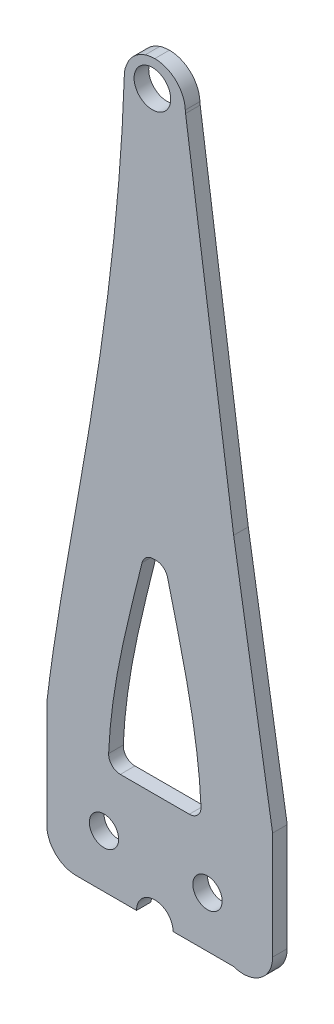
ISO-10303-21;
HEADER;
FILE_DESCRIPTION(('STEP AP214'),'2;1');
FILE_NAME('part.step','',(''),(''),'','','');
FILE_SCHEMA(('AUTOMOTIVE_DESIGN { 1 0 10303 214 1 1 1 1 }'));
ENDSEC;
DATA;
#1=APPLICATION_CONTEXT('core data for automotive mechanical design processes');
#2=APPLICATION_PROTOCOL_DEFINITION('international standard','automotive_design',2000,#1);
#3=PRODUCT_CONTEXT('',#1,'mechanical');
#4=PRODUCT('Part','Part','',(#3));
#5=PRODUCT_RELATED_PRODUCT_CATEGORY('part','',(#4));
#6=PRODUCT_DEFINITION_FORMATION('','',#4);
#7=PRODUCT_DEFINITION_CONTEXT('part definition',#1,'design');
#8=PRODUCT_DEFINITION('design','',#6,#7);
#9=PRODUCT_DEFINITION_SHAPE('','',#8);
#10=(LENGTH_UNIT() NAMED_UNIT(*) SI_UNIT(.MILLI.,.METRE.));
#11=(NAMED_UNIT(*) PLANE_ANGLE_UNIT() SI_UNIT($,.RADIAN.));
#12=(NAMED_UNIT(*) SI_UNIT($,.STERADIAN.) SOLID_ANGLE_UNIT());
#13=UNCERTAINTY_MEASURE_WITH_UNIT(LENGTH_MEASURE(1.E-05),#10,'distance_accuracy_value','');
#14=(GEOMETRIC_REPRESENTATION_CONTEXT(3) GLOBAL_UNCERTAINTY_ASSIGNED_CONTEXT((#13)) GLOBAL_UNIT_ASSIGNED_CONTEXT((#10,
#11,#12)) REPRESENTATION_CONTEXT('',''));
#15=CARTESIAN_POINT('',(0.,0.,0.));
#16=DIRECTION('',(0.,0.,1.));
#17=DIRECTION('',(1.,0.,0.));
#18=AXIS2_PLACEMENT_3D('',#15,#16,#17);
#19=CARTESIAN_POINT('',(-6.83261232794057,-62.1482920645806,1.27));
#20=DIRECTION('',(0.,1.,0.));
#21=DIRECTION('',(0.,0.,1.));
#22=AXIS2_PLACEMENT_3D('',#19,#20,#21);
#23=PLANE('',#22);
#24=DIRECTION('',(1.,0.,0.));
#25=VECTOR('',#24,1.);
#26=CARTESIAN_POINT('',(-6.83261232794057,-62.1482920645806,0.));
#27=LINE('',#26,#25);
#28=CARTESIAN_POINT('',(-6.83261232794057,-62.1482920645806,0.));
#29=VERTEX_POINT('',#28);
#30=CARTESIAN_POINT('',(-1.5875,-62.1482920645806,0.));
#31=VERTEX_POINT('',#30);
#32=EDGE_CURVE('E332',#29,#31,#27,.T.);
#33=ORIENTED_EDGE('',*,*,#32,.T.);
#34=DIRECTION('',(0.,0.,1.));
#35=VECTOR('',#34,1.);
#36=CARTESIAN_POINT('',(-1.5875,-62.1482920645806,0.));
#37=LINE('',#36,#35);
#38=CARTESIAN_POINT('',(-1.5875,-62.1482920645806,1.27));
#39=VERTEX_POINT('',#38);
#40=EDGE_CURVE('E209',#31,#39,#37,.T.);
#41=ORIENTED_EDGE('',*,*,#40,.T.);
#42=DIRECTION('',(1.,0.,0.));
#43=VECTOR('',#42,1.);
#44=CARTESIAN_POINT('',(-6.83261232794057,-62.1482920645806,1.27));
#45=LINE('',#44,#43);
#46=CARTESIAN_POINT('',(-6.83261232794057,-62.1482920645806,1.27));
#47=VERTEX_POINT('',#46);
#48=EDGE_CURVE('E219',#47,#39,#45,.T.);
#49=ORIENTED_EDGE('',*,*,#48,.F.);
#50=DIRECTION('',(0.,0.,-1.));
#51=VECTOR('',#50,1.);
#52=CARTESIAN_POINT('',(-6.83261232794057,-62.1482920645806,1.27));
#53=LINE('',#52,#51);
#54=EDGE_CURVE('E324',#47,#29,#53,.T.);
#55=ORIENTED_EDGE('',*,*,#54,.T.);
#56=EDGE_LOOP('',(#33,#41,#49,#55));
#57=FACE_BOUND('',#56,.T.);
#58=ADVANCED_FACE('F35',(#57),#23,.F.);
#59=CARTESIAN_POINT('',(-2.44371924299133,0.982062169702059,1.27));
#60=DIRECTION('',(0.,0.,-1.));
#61=DIRECTION('',(-1.,0.,0.));
#62=AXIS2_PLACEMENT_3D('',#59,#60,#61);
#63=PLANE('',#62);
#64=CARTESIAN_POINT('',(-0.21004257552965,0.287306267506726,1.27));
#65=DIRECTION('',(0.,0.,-1.));
#66=DIRECTION('',(-1.,0.,0.));
#67=AXIS2_PLACEMENT_3D('',#64,#65,#66);
#68=CIRCLE('',#67,1.5875);
#69=CARTESIAN_POINT('',(-1.79754257552965,0.287306267506726,1.27));
#70=VERTEX_POINT('',#69);
#71=EDGE_CURVE('E770',#70,#70,#68,.T.);
#72=ORIENTED_EDGE('',*,*,#71,.T.);
#73=EDGE_LOOP('',(#72));
#74=FACE_BOUND('',#73,.T.);
#75=CARTESIAN_POINT('',(4.5713098942523,-57.7408408906354,1.27));
#76=DIRECTION('',(0.,0.,-1.));
#77=DIRECTION('',(-1.,0.,0.));
#78=AXIS2_PLACEMENT_3D('',#75,#76,#77);
#79=CIRCLE('',#78,1.27);
#80=CARTESIAN_POINT('',(3.3013098942523,-57.7408408906354,1.27));
#81=VERTEX_POINT('',#80);
#82=EDGE_CURVE('E777',#81,#81,#79,.T.);
#83=ORIENTED_EDGE('',*,*,#82,.T.);
#84=EDGE_LOOP('',(#83));
#85=FACE_BOUND('',#84,.T.);
#86=CARTESIAN_POINT('',(-4.40745117394522,-57.5769821703283,1.27));
#87=DIRECTION('',(0.,0.,-1.));
#88=DIRECTION('',(-1.,0.,0.));
#89=AXIS2_PLACEMENT_3D('',#86,#87,#88);
#90=CIRCLE('',#89,1.27);
#91=CARTESIAN_POINT('',(-5.67745117394522,-57.5769821703283,1.27));
#92=VERTEX_POINT('',#91);
#93=EDGE_CURVE('E210',#92,#92,#90,.T.);
#94=ORIENTED_EDGE('',*,*,#93,.T.);
#95=EDGE_LOOP('',(#94));
#96=FACE_BOUND('',#95,.T.);
#97=ORIENTED_EDGE('',*,*,#48,.T.);
#98=CARTESIAN_POINT('',(0.,-62.1482920645806,1.27));
#99=DIRECTION('',(0.,0.,1.));
#100=DIRECTION('',(1.,0.,0.));
#101=AXIS2_PLACEMENT_3D('',#98,#99,#100);
#102=CIRCLE('',#101,1.5875);
#103=CARTESIAN_POINT('',(1.5875,-62.1482920645806,1.27));
#104=VERTEX_POINT('',#103);
#105=EDGE_CURVE('E204',#104,#39,#102,.T.);
#106=ORIENTED_EDGE('',*,*,#105,.F.);
#107=CARTESIAN_POINT('',(6.83259999999998,-62.1482920645806,1.27));
#108=VERTEX_POINT('',#107);
#109=EDGE_CURVE('E216',#104,#108,#45,.T.);
#110=ORIENTED_EDGE('',*,*,#109,.T.);
#111=CARTESIAN_POINT('',(7.67799206458059,-59.7531199139079,1.27));
#112=DIRECTION('',(0.,0.,1.));
#113=DIRECTION('',(-1.,0.,0.));
#114=AXIS2_PLACEMENT_3D('',#111,#112,#113);
#115=CIRCLE('',#114,2.53998767205942);
#116=CARTESIAN_POINT('',(10.21797973664,-59.7531199139079,1.27));
#117=VERTEX_POINT('',#116);
#118=EDGE_CURVE('E227',#108,#117,#115,.T.);
#119=ORIENTED_EDGE('',*,*,#118,.T.);
#120=DIRECTION('',(0.,1.,0.));
#121=VECTOR('',#120,1.);
#122=CARTESIAN_POINT('',(10.21797973664,-59.7531199139079,1.27));
#123=LINE('',#122,#121);
#124=CARTESIAN_POINT('',(10.21797973664,-50.4317123279406,1.27));
#125=VERTEX_POINT('',#124);
#126=EDGE_CURVE('E233',#117,#125,#123,.T.);
#127=ORIENTED_EDGE('',*,*,#126,.T.);
#128=DIRECTION('',(-0.161209906120702,0.986920141738203,0.));
#129=VECTOR('',#128,1.);
#130=CARTESIAN_POINT('',(6.8397920645805,-29.7505920645806,1.27));
#131=LINE('',#130,#129);
#132=CARTESIAN_POINT('',(6.8397920645805,-29.7505920645806,1.27));
#133=VERTEX_POINT('',#132);
#134=EDGE_CURVE('E235',#125,#133,#131,.T.);
#135=ORIENTED_EDGE('',*,*,#134,.T.);
#136=DIRECTION('',(-0.139548803646805,0.990215194490948,0.));
#137=VECTOR('',#136,1.);
#138=CARTESIAN_POINT('',(2.66780600763085,-0.146870091787488,1.27));
#139=LINE('',#138,#137);
#140=CARTESIAN_POINT('',(2.66780600763085,-0.146870091787487,1.27));
#141=VERTEX_POINT('',#140);
#142=EDGE_CURVE('E237',#133,#141,#139,.T.);
#143=ORIENTED_EDGE('',*,*,#142,.T.);
#144=CARTESIAN_POINT('',(5.18295260163786,0.207583869475397,1.27));
#145=DIRECTION('',(0.,0.,-1.));
#146=DIRECTION('',(1.,0.,0.));
#147=AXIS2_PLACEMENT_3D('',#144,#145,#146);
#148=CIRCLE('',#147,2.54);
#149=CARTESIAN_POINT('',(2.6449873670479,0.105935121265018,1.27));
#150=VERTEX_POINT('',#149);
#151=EDGE_CURVE('E239',#141,#150,#148,.T.);
#152=ORIENTED_EDGE('',*,*,#151,.T.);
#153=CARTESIAN_POINT('',(0.,0.,1.27));
#154=DIRECTION('',(0.,0.,1.));
#155=DIRECTION('',(1.,0.,0.));
#156=AXIS2_PLACEMENT_3D('',#153,#154,#155);
#157=CIRCLE('',#156,2.64710793541941);
#158=CARTESIAN_POINT('',(0.,2.64710793541941,1.27));
#159=VERTEX_POINT('',#158);
#160=EDGE_CURVE('E241',#150,#159,#157,.T.);
#161=ORIENTED_EDGE('',*,*,#160,.T.);
#162=CARTESIAN_POINT('',(0.,2.64710793541941,1.27));
#163=CARTESIAN_POINT('',(-0.561984482470919,2.60663561029563,1.27));
#164=CARTESIAN_POINT('',(-0.837703259299196,2.5110622595069,1.27));
#165=B_SPLINE_CURVE_WITH_KNOTS('',2,(#162,#163,#164),.UNSPECIFIED.,.F.,.F.,(3,3),(0.,
0.00724910987275377),.UNSPECIFIED.);
#166=CARTESIAN_POINT('',(-0.837703259299196,2.5110622595069,1.27));
#167=VERTEX_POINT('',#166);
#168=EDGE_CURVE('E243',#159,#167,#165,.T.);
#169=ORIENTED_EDGE('',*,*,#168,.T.);
#170=CARTESIAN_POINT('',(0.,0.,1.27));
#171=DIRECTION('',(0.,0.,1.));
#172=DIRECTION('',(1.,0.,0.));
#173=AXIS2_PLACEMENT_3D('',#170,#171,#172);
#174=CIRCLE('',#173,2.64710793541941);
#175=CARTESIAN_POINT('',(-2.21699440858194,1.44641495224463,1.27));
#176=VERTEX_POINT('',#175);
#177=EDGE_CURVE('E248',#167,#176,#174,.T.);
#178=ORIENTED_EDGE('',*,*,#177,.T.);
#179=CARTESIAN_POINT('',(-2.21699440858194,1.44641495224463,1.27));
#180=CARTESIAN_POINT('',(-2.348446751188,1.24961245833529,1.27));
#181=CARTESIAN_POINT('',(-2.56220625608889,0.722759124524073,1.27));
#182=CARTESIAN_POINT('',(-2.60080051351804,0.492967656793763,1.27));
#183=B_SPLINE_CURVE_WITH_KNOTS('',3,(#179,#180,#181,#182),.UNSPECIFIED.,.F.,.F.,(4,4),
(0.0221319735605502,0.030911059202728),.UNSPECIFIED.);
#184=CARTESIAN_POINT('',(-2.60080051351804,0.492967656793763,1.27));
#185=VERTEX_POINT('',#184);
#186=EDGE_CURVE('E635',#176,#185,#183,.T.);
#187=ORIENTED_EDGE('',*,*,#186,.T.);
#188=CARTESIAN_POINT('',(0.,0.,1.27));
#189=DIRECTION('',(0.,0.,1.));
#190=DIRECTION('',(1.,0.,0.));
#191=AXIS2_PLACEMENT_3D('',#188,#189,#190);
#192=CIRCLE('',#191,2.64710793541941);
#193=CARTESIAN_POINT('',(-2.64682542507343,0.0386728709209459,1.27));
#194=VERTEX_POINT('',#193);
#195=EDGE_CURVE('E640',#185,#194,#192,.T.);
#196=ORIENTED_EDGE('',*,*,#195,.T.);
#197=CARTESIAN_POINT('',(-5.18655434573088,0.0757809505820941,1.27));
#198=DIRECTION('',(0.,0.,-1.));
#199=DIRECTION('',(-1.,0.,0.));
#200=AXIS2_PLACEMENT_3D('',#197,#198,#199);
#201=CIRCLE('',#200,2.54);
#202=CARTESIAN_POINT('',(-2.64797487520138,-0.00915591895125944,1.27));
#203=VERTEX_POINT('',#202);
#204=EDGE_CURVE('E306',#194,#203,#201,.T.);
#205=ORIENTED_EDGE('',*,*,#204,.T.);
#206=CARTESIAN_POINT('',(-2.64797487520138,-0.00915591895125944,1.27));
#207=CARTESIAN_POINT('',(-2.98296697384242,-10.0213457850481,1.27));
#208=CARTESIAN_POINT('',(-5.2116962324808,-26.7487175756275,1.27));
#209=CARTESIAN_POINT('',(-8.55903806059016,-43.5812955669057,1.27));
#210=CARTESIAN_POINT('',(-9.37259999999999,-50.4317,1.27));
#211=B_SPLINE_CURVE_WITH_KNOTS('',3,(#206,#207,#208,#209,#210),.UNSPECIFIED.,.F.,.F.,(4,1,4),
(0.035874881649531,0.412185068340635,0.675162615695914),.UNSPECIFIED.);
#212=CARTESIAN_POINT('',(-9.37259999999999,-50.4317,1.27));
#213=VERTEX_POINT('',#212);
#214=EDGE_CURVE('E301',#203,#213,#211,.T.);
#215=ORIENTED_EDGE('',*,*,#214,.T.);
#216=DIRECTION('',(0.,-1.,0.));
#217=VECTOR('',#216,1.);
#218=CARTESIAN_POINT('',(-9.37259999999999,-59.6083043925212,1.27));
#219=LINE('',#218,#217);
#220=CARTESIAN_POINT('',(-9.37259999999999,-59.6083043925212,1.27));
#221=VERTEX_POINT('',#220);
#222=EDGE_CURVE('E228',#213,#221,#219,.T.);
#223=ORIENTED_EDGE('',*,*,#222,.T.);
#224=CARTESIAN_POINT('',(-6.83261232794057,-59.6083043925212,1.27));
#225=DIRECTION('',(0.,0.,1.));
#226=DIRECTION('',(1.,0.,0.));
#227=AXIS2_PLACEMENT_3D('',#224,#225,#226);
#228=CIRCLE('',#227,2.53998767205942);
#229=EDGE_CURVE('E225',#221,#47,#228,.T.);
#230=ORIENTED_EDGE('',*,*,#229,.T.);
#231=EDGE_LOOP('',(#97,#106,#110,#119,#127,#135,#143,#152,#161,#169,#178,#187,#196,#205,#215,
#223,#230));
#232=FACE_BOUND('',#231,.T.);
#233=CARTESIAN_POINT('',(-4.00805112548578,-51.5691104419308,1.27));
#234=CARTESIAN_POINT('',(-3.9704542075713,-50.7009990975464,1.27));
#235=CARTESIAN_POINT('',(-3.76215784755244,-48.0392206250638,1.27));
#236=CARTESIAN_POINT('',(-3.06467727084067,-43.8925883522856,1.27));
#237=CARTESIAN_POINT('',(-2.03959365662928,-39.517305496251,1.27));
#238=CARTESIAN_POINT('',(-1.38280330944818,-36.9053760285477,1.27));
#239=CARTESIAN_POINT('',(-1.10391192986411,-35.7742493061266,1.27));
#240=B_SPLINE_CURVE_WITH_KNOTS('',3,(#233,#234,#235,#236,#237,#238,#239),.UNSPECIFIED.,.F.,.F.,
(4,1,1,1,4),(0.0590398037342568,0.20424763976089,0.505314101052086,0.760840145915916,
0.955648588552822),.UNSPECIFIED.);
#241=CARTESIAN_POINT('',(-4.00805112548578,-51.5691104419308,1.27));
#242=VERTEX_POINT('',#241);
#243=CARTESIAN_POINT('',(-1.10391192986411,-35.7742493061266,1.27));
#244=VERTEX_POINT('',#243);
#245=EDGE_CURVE('E59',#242,#244,#240,.T.);
#246=ORIENTED_EDGE('',*,*,#245,.T.);
#247=CARTESIAN_POINT('',(-0.117454030413628,-36.0174710416104,1.27));
#248=DIRECTION('',(0.,0.,1.));
#249=DIRECTION('',(1.,0.,0.));
#250=AXIS2_PLACEMENT_3D('',#247,#248,#249);
#251=CIRCLE('',#250,1.016);
#252=CARTESIAN_POINT('',(-0.117454030413623,-35.0014710416104,1.27));
#253=VERTEX_POINT('',#252);
#254=EDGE_CURVE('E345',#244,#253,#251,.F.);
#255=ORIENTED_EDGE('',*,*,#254,.T.);
#256=DIRECTION('',(-1.,0.,0.));
#257=VECTOR('',#256,1.);
#258=CARTESIAN_POINT('',(-1.03390021263256E-12,-35.0014710416104,1.27));
#259=LINE('',#258,#257);
#260=CARTESIAN_POINT('',(0.117454030413648,-35.0014710416104,1.27));
#261=VERTEX_POINT('',#260);
#262=EDGE_CURVE('E615',#261,#253,#259,.T.);
#263=ORIENTED_EDGE('',*,*,#262,.F.);
#264=CARTESIAN_POINT('',(0.117454030413628,-36.0174710416104,1.27));
#265=DIRECTION('',(0.,0.,1.));
#266=DIRECTION('',(1.,0.,0.));
#267=AXIS2_PLACEMENT_3D('',#264,#265,#266);
#268=CIRCLE('',#267,1.016);
#269=CARTESIAN_POINT('',(1.10391192986411,-35.7742493061266,1.27));
#270=VERTEX_POINT('',#269);
#271=EDGE_CURVE('E609',#270,#261,#268,.T.);
#272=ORIENTED_EDGE('',*,*,#271,.F.);
#273=CARTESIAN_POINT('',(4.00805112548578,-51.5691104419308,1.27));
#274=CARTESIAN_POINT('',(3.9704542075713,-50.7009990975465,1.27));
#275=CARTESIAN_POINT('',(3.76215784755244,-48.0392206250637,1.27));
#276=CARTESIAN_POINT('',(3.06467727084067,-43.8925883522856,1.27));
#277=CARTESIAN_POINT('',(2.03959365662929,-39.517305496251,1.27));
#278=CARTESIAN_POINT('',(1.38280330944818,-36.9053760285477,1.27));
#279=CARTESIAN_POINT('',(1.10391192986411,-35.7742493061266,1.27));
#280=B_SPLINE_CURVE_WITH_KNOTS('',3,(#273,#274,#275,#276,#277,#278,#279),.UNSPECIFIED.,.F.,.F.,
(4,1,1,1,4),(0.0590398037342572,0.204247639760891,0.505314101052086,0.760840145915916,
0.955648588552822),.UNSPECIFIED.);
#281=CARTESIAN_POINT('',(4.00805112548579,-51.5691104419308,1.27));
#282=VERTEX_POINT('',#281);
#283=EDGE_CURVE('E604',#282,#270,#280,.T.);
#284=ORIENTED_EDGE('',*,*,#283,.F.);
#285=CARTESIAN_POINT('',(2.99300262138571,-51.6130710416104,1.27));
#286=DIRECTION('',(0.,0.,1.));
#287=DIRECTION('',(1.,0.,0.));
#288=AXIS2_PLACEMENT_3D('',#285,#286,#287);
#289=CIRCLE('',#288,1.016);
#290=CARTESIAN_POINT('',(2.99300262138571,-52.6290710416104,1.27));
#291=VERTEX_POINT('',#290);
#292=EDGE_CURVE('E601',#282,#291,#289,.F.);
#293=ORIENTED_EDGE('',*,*,#292,.T.);
#294=DIRECTION('',(-1.,0.,0.));
#295=VECTOR('',#294,1.);
#296=CARTESIAN_POINT('',(0.,-52.6290710416104,1.27));
#297=LINE('',#296,#295);
#298=CARTESIAN_POINT('',(-2.99300262138571,-52.6290710416104,1.27));
#299=VERTEX_POINT('',#298);
#300=EDGE_CURVE('E598',#291,#299,#297,.T.);
#301=ORIENTED_EDGE('',*,*,#300,.T.);
#302=CARTESIAN_POINT('',(-2.9930026213857,-51.6130710416104,1.27));
#303=DIRECTION('',(0.,0.,1.));
#304=DIRECTION('',(1.,0.,0.));
#305=AXIS2_PLACEMENT_3D('',#302,#303,#304);
#306=CIRCLE('',#305,1.016);
#307=EDGE_CURVE('E592',#242,#299,#306,.T.);
#308=ORIENTED_EDGE('',*,*,#307,.F.);
#309=EDGE_LOOP('',(#246,#255,#263,#272,#284,#293,#301,#308));
#310=FACE_BOUND('',#309,.T.);
#311=ADVANCED_FACE('F214',(#74,#85,#96,#232,#310),#63,.F.);
#312=CARTESIAN_POINT('',(-2.44371924299133,0.982062169702059,0.));
#313=DIRECTION('',(0.,0.,-1.));
#314=DIRECTION('',(-1.,0.,0.));
#315=AXIS2_PLACEMENT_3D('',#312,#313,#314);
#316=PLANE('',#315);
#317=CARTESIAN_POINT('',(-0.21004257552965,0.287306267506726,0.));
#318=DIRECTION('',(0.,0.,-1.));
#319=DIRECTION('',(-1.,0.,0.));
#320=AXIS2_PLACEMENT_3D('',#317,#318,#319);
#321=CIRCLE('',#320,1.5875);
#322=CARTESIAN_POINT('',(-1.79754257552965,0.287306267506726,0.));
#323=VERTEX_POINT('',#322);
#324=EDGE_CURVE('E772',#323,#323,#321,.T.);
#325=ORIENTED_EDGE('',*,*,#324,.F.);
#326=EDGE_LOOP('',(#325));
#327=FACE_BOUND('',#326,.T.);
#328=CARTESIAN_POINT('',(4.5713098942523,-57.7408408906354,0.));
#329=DIRECTION('',(0.,0.,-1.));
#330=DIRECTION('',(-1.,0.,0.));
#331=AXIS2_PLACEMENT_3D('',#328,#329,#330);
#332=CIRCLE('',#331,1.27);
#333=CARTESIAN_POINT('',(3.3013098942523,-57.7408408906354,0.));
#334=VERTEX_POINT('',#333);
#335=EDGE_CURVE('E774',#334,#334,#332,.T.);
#336=ORIENTED_EDGE('',*,*,#335,.F.);
#337=EDGE_LOOP('',(#336));
#338=FACE_BOUND('',#337,.T.);
#339=CARTESIAN_POINT('',(-4.40745117394522,-57.5769821703283,0.));
#340=DIRECTION('',(0.,0.,-1.));
#341=DIRECTION('',(-1.,0.,0.));
#342=AXIS2_PLACEMENT_3D('',#339,#340,#341);
#343=CIRCLE('',#342,1.27);
#344=CARTESIAN_POINT('',(-5.67745117394522,-57.5769821703283,0.));
#345=VERTEX_POINT('',#344);
#346=EDGE_CURVE('E336',#345,#345,#343,.T.);
#347=ORIENTED_EDGE('',*,*,#346,.F.);
#348=EDGE_LOOP('',(#347));
#349=FACE_BOUND('',#348,.T.);
#350=CARTESIAN_POINT('',(0.,-62.1482920645806,0.));
#351=DIRECTION('',(0.,0.,1.));
#352=DIRECTION('',(1.,0.,0.));
#353=AXIS2_PLACEMENT_3D('',#350,#351,#352);
#354=CIRCLE('',#353,1.5875);
#355=CARTESIAN_POINT('',(1.5875,-62.1482920645806,0.));
#356=VERTEX_POINT('',#355);
#357=EDGE_CURVE('E51',#356,#31,#354,.T.);
#358=ORIENTED_EDGE('',*,*,#357,.T.);
#359=ORIENTED_EDGE('',*,*,#32,.F.);
#360=CARTESIAN_POINT('',(-6.83261232794057,-59.6083043925212,0.));
#361=DIRECTION('',(0.,0.,1.));
#362=DIRECTION('',(1.,0.,0.));
#363=AXIS2_PLACEMENT_3D('',#360,#361,#362);
#364=CIRCLE('',#363,2.53998767205942);
#365=CARTESIAN_POINT('',(-9.37259999999999,-59.6083043925212,0.));
#366=VERTEX_POINT('',#365);
#367=EDGE_CURVE('E327',#366,#29,#364,.T.);
#368=ORIENTED_EDGE('',*,*,#367,.F.);
#369=DIRECTION('',(0.,-1.,0.));
#370=VECTOR('',#369,1.);
#371=CARTESIAN_POINT('',(-9.37259999999999,-59.6083043925212,0.));
#372=LINE('',#371,#370);
#373=CARTESIAN_POINT('',(-9.37259999999999,-50.4317,0.));
#374=VERTEX_POINT('',#373);
#375=EDGE_CURVE('E321',#374,#366,#372,.T.);
#376=ORIENTED_EDGE('',*,*,#375,.F.);
#377=CARTESIAN_POINT('',(-2.64797487520138,-0.00915591895125944,0.));
#378=CARTESIAN_POINT('',(-2.98296697384242,-10.0213457850481,0.));
#379=CARTESIAN_POINT('',(-5.2116962324808,-26.7487175756275,0.));
#380=CARTESIAN_POINT('',(-8.55903806059016,-43.5812955669057,0.));
#381=CARTESIAN_POINT('',(-9.37259999999999,-50.4317,0.));
#382=B_SPLINE_CURVE_WITH_KNOTS('',3,(#377,#378,#379,#380,#381),.UNSPECIFIED.,.F.,.F.,(4,1,4),
(0.035874881649531,0.412185068340635,0.675162615695914),.UNSPECIFIED.);
#383=CARTESIAN_POINT('',(-2.64797487520138,-0.00915591895125944,0.));
#384=VERTEX_POINT('',#383);
#385=EDGE_CURVE('E655',#384,#374,#382,.T.);
#386=ORIENTED_EDGE('',*,*,#385,.F.);
#387=CARTESIAN_POINT('',(-5.18655434573088,0.0757809505820941,0.));
#388=DIRECTION('',(0.,0.,-1.));
#389=DIRECTION('',(-1.,0.,0.));
#390=AXIS2_PLACEMENT_3D('',#387,#388,#389);
#391=CIRCLE('',#390,2.54);
#392=CARTESIAN_POINT('',(-2.64682542507343,0.0386728709209459,0.));
#393=VERTEX_POINT('',#392);
#394=EDGE_CURVE('E652',#393,#384,#391,.T.);
#395=ORIENTED_EDGE('',*,*,#394,.F.);
#396=CARTESIAN_POINT('',(0.,0.,0.));
#397=DIRECTION('',(0.,0.,1.));
#398=DIRECTION('',(1.,0.,0.));
#399=AXIS2_PLACEMENT_3D('',#396,#397,#398);
#400=CIRCLE('',#399,2.64710793541941);
#401=CARTESIAN_POINT('',(-2.60080051351804,0.492967656793763,0.));
#402=VERTEX_POINT('',#401);
#403=EDGE_CURVE('E660',#402,#393,#400,.T.);
#404=ORIENTED_EDGE('',*,*,#403,.F.);
#405=CARTESIAN_POINT('',(-2.21699440858194,1.44641495224463,0.));
#406=CARTESIAN_POINT('',(-2.348446751188,1.24961245833529,0.));
#407=CARTESIAN_POINT('',(-2.56220625608889,0.722759124524073,0.));
#408=CARTESIAN_POINT('',(-2.60080051351804,0.492967656793763,0.));
#409=B_SPLINE_CURVE_WITH_KNOTS('',3,(#405,#406,#407,#408),.UNSPECIFIED.,.F.,.F.,(4,4),
(0.0221319735605502,0.030911059202728),.UNSPECIFIED.);
#410=CARTESIAN_POINT('',(-2.21699440858194,1.44641495224463,0.));
#411=VERTEX_POINT('',#410);
#412=EDGE_CURVE('E622',#411,#402,#409,.T.);
#413=ORIENTED_EDGE('',*,*,#412,.F.);
#414=CARTESIAN_POINT('',(0.,0.,0.));
#415=DIRECTION('',(0.,0.,1.));
#416=DIRECTION('',(1.,0.,0.));
#417=AXIS2_PLACEMENT_3D('',#414,#415,#416);
#418=CIRCLE('',#417,2.64710793541941);
#419=CARTESIAN_POINT('',(-0.837703259299196,2.5110622595069,0.));
#420=VERTEX_POINT('',#419);
#421=EDGE_CURVE('E641',#420,#411,#418,.T.);
#422=ORIENTED_EDGE('',*,*,#421,.F.);
#423=CARTESIAN_POINT('',(0.,2.64710793541941,0.));
#424=CARTESIAN_POINT('',(-0.561984482470919,2.60663561029563,0.));
#425=CARTESIAN_POINT('',(-0.837703259299196,2.5110622595069,0.));
#426=B_SPLINE_CURVE_WITH_KNOTS('',2,(#423,#424,#425),.UNSPECIFIED.,.F.,.F.,(3,3),(0.,
0.00724910987275377),.UNSPECIFIED.);
#427=CARTESIAN_POINT('',(0.,2.64710793541941,0.));
#428=VERTEX_POINT('',#427);
#429=EDGE_CURVE('E686',#428,#420,#426,.T.);
#430=ORIENTED_EDGE('',*,*,#429,.F.);
#431=CARTESIAN_POINT('',(0.,0.,0.));
#432=DIRECTION('',(0.,0.,1.));
#433=DIRECTION('',(1.,0.,0.));
#434=AXIS2_PLACEMENT_3D('',#431,#432,#433);
#435=CIRCLE('',#434,2.64710793541941);
#436=CARTESIAN_POINT('',(2.6449873670479,0.105935121265018,0.));
#437=VERTEX_POINT('',#436);
#438=EDGE_CURVE('E684',#437,#428,#435,.T.);
#439=ORIENTED_EDGE('',*,*,#438,.F.);
#440=CARTESIAN_POINT('',(5.18295260163786,0.207583869475397,0.));
#441=DIRECTION('',(0.,0.,-1.));
#442=DIRECTION('',(1.,0.,0.));
#443=AXIS2_PLACEMENT_3D('',#440,#441,#442);
#444=CIRCLE('',#443,2.54);
#445=CARTESIAN_POINT('',(2.66780600763085,-0.146870091787487,0.));
#446=VERTEX_POINT('',#445);
#447=EDGE_CURVE('E682',#446,#437,#444,.T.);
#448=ORIENTED_EDGE('',*,*,#447,.F.);
#449=DIRECTION('',(-0.139548803646805,0.990215194490948,0.));
#450=VECTOR('',#449,1.);
#451=CARTESIAN_POINT('',(2.66780600763085,-0.146870091787488,0.));
#452=LINE('',#451,#450);
#453=CARTESIAN_POINT('',(6.8397920645805,-29.7505920645806,0.));
#454=VERTEX_POINT('',#453);
#455=EDGE_CURVE('E680',#454,#446,#452,.T.);
#456=ORIENTED_EDGE('',*,*,#455,.F.);
#457=DIRECTION('',(-0.161209906120702,0.986920141738203,0.));
#458=VECTOR('',#457,1.);
#459=CARTESIAN_POINT('',(6.8397920645805,-29.7505920645806,0.));
#460=LINE('',#459,#458);
#461=CARTESIAN_POINT('',(10.21797973664,-50.4317123279406,0.));
#462=VERTEX_POINT('',#461);
#463=EDGE_CURVE('E678',#462,#454,#460,.T.);
#464=ORIENTED_EDGE('',*,*,#463,.F.);
#465=DIRECTION('',(0.,1.,0.));
#466=VECTOR('',#465,1.);
#467=CARTESIAN_POINT('',(10.21797973664,-59.7531199139079,0.));
#468=LINE('',#467,#466);
#469=CARTESIAN_POINT('',(10.21797973664,-59.7531199139079,0.));
#470=VERTEX_POINT('',#469);
#471=EDGE_CURVE('E676',#470,#462,#468,.T.);
#472=ORIENTED_EDGE('',*,*,#471,.F.);
#473=CARTESIAN_POINT('',(7.67799206458059,-59.7531199139079,0.));
#474=DIRECTION('',(0.,0.,1.));
#475=DIRECTION('',(-1.,0.,0.));
#476=AXIS2_PLACEMENT_3D('',#473,#474,#475);
#477=CIRCLE('',#476,2.53998767205942);
#478=CARTESIAN_POINT('',(6.83259999999998,-62.1482920645806,0.));
#479=VERTEX_POINT('',#478);
#480=EDGE_CURVE('E674',#479,#470,#477,.T.);
#481=ORIENTED_EDGE('',*,*,#480,.F.);
#482=EDGE_CURVE('E672',#356,#479,#27,.T.);
#483=ORIENTED_EDGE('',*,*,#482,.F.);
#484=EDGE_LOOP('',(#358,#359,#368,#376,#386,#395,#404,#413,#422,#430,#439,#448,#456,#464,#472,
#481,#483));
#485=FACE_BOUND('',#484,.T.);
#486=CARTESIAN_POINT('',(-0.117454030413628,-36.0174710416104,0.));
#487=DIRECTION('',(0.,0.,1.));
#488=DIRECTION('',(1.,0.,0.));
#489=AXIS2_PLACEMENT_3D('',#486,#487,#488);
#490=CIRCLE('',#489,1.016);
#491=CARTESIAN_POINT('',(-1.10391192986411,-35.7742493061266,0.));
#492=VERTEX_POINT('',#491);
#493=CARTESIAN_POINT('',(-0.117454030413623,-35.0014710416104,0.));
#494=VERTEX_POINT('',#493);
#495=EDGE_CURVE('E586',#492,#494,#490,.F.);
#496=ORIENTED_EDGE('',*,*,#495,.F.);
#497=CARTESIAN_POINT('',(-4.00805112548578,-51.5691104419308,0.));
#498=CARTESIAN_POINT('',(-3.9704542075713,-50.7009990975464,0.));
#499=CARTESIAN_POINT('',(-3.76215784755244,-48.0392206250638,0.));
#500=CARTESIAN_POINT('',(-3.06467727084067,-43.8925883522856,0.));
#501=CARTESIAN_POINT('',(-2.03959365662928,-39.517305496251,0.));
#502=CARTESIAN_POINT('',(-1.38280330944818,-36.9053760285477,0.));
#503=CARTESIAN_POINT('',(-1.10391192986411,-35.7742493061266,0.));
#504=B_SPLINE_CURVE_WITH_KNOTS('',3,(#497,#498,#499,#500,#501,#502,#503),.UNSPECIFIED.,.F.,.F.,
(4,1,1,1,4),(0.0590398037342568,0.20424763976089,0.505314101052086,0.760840145915916,
0.955648588552822),.UNSPECIFIED.);
#505=CARTESIAN_POINT('',(-4.00805112548578,-51.5691104419308,0.));
#506=VERTEX_POINT('',#505);
#507=EDGE_CURVE('E339',#506,#492,#504,.T.);
#508=ORIENTED_EDGE('',*,*,#507,.F.);
#509=CARTESIAN_POINT('',(-2.9930026213857,-51.6130710416104,0.));
#510=DIRECTION('',(0.,0.,1.));
#511=DIRECTION('',(1.,0.,0.));
#512=AXIS2_PLACEMENT_3D('',#509,#510,#511);
#513=CIRCLE('',#512,1.016);
#514=CARTESIAN_POINT('',(-2.99300262138571,-52.6290710416104,0.));
#515=VERTEX_POINT('',#514);
#516=EDGE_CURVE('E344',#506,#515,#513,.T.);
#517=ORIENTED_EDGE('',*,*,#516,.T.);
#518=DIRECTION('',(-1.,0.,0.));
#519=VECTOR('',#518,1.);
#520=CARTESIAN_POINT('',(0.,-52.6290710416104,0.));
#521=LINE('',#520,#519);
#522=CARTESIAN_POINT('',(2.99300262138571,-52.6290710416104,0.));
#523=VERTEX_POINT('',#522);
#524=EDGE_CURVE('E761',#523,#515,#521,.T.);
#525=ORIENTED_EDGE('',*,*,#524,.F.);
#526=CARTESIAN_POINT('',(2.99300262138571,-51.6130710416104,0.));
#527=DIRECTION('',(0.,0.,1.));
#528=DIRECTION('',(1.,0.,0.));
#529=AXIS2_PLACEMENT_3D('',#526,#527,#528);
#530=CIRCLE('',#529,1.016);
#531=CARTESIAN_POINT('',(4.00805112548579,-51.5691104419308,0.));
#532=VERTEX_POINT('',#531);
#533=EDGE_CURVE('E577',#532,#523,#530,.F.);
#534=ORIENTED_EDGE('',*,*,#533,.F.);
#535=CARTESIAN_POINT('',(4.00805112548578,-51.5691104419308,0.));
#536=CARTESIAN_POINT('',(3.9704542075713,-50.7009990975465,0.));
#537=CARTESIAN_POINT('',(3.76215784755244,-48.0392206250637,0.));
#538=CARTESIAN_POINT('',(3.06467727084067,-43.8925883522856,0.));
#539=CARTESIAN_POINT('',(2.03959365662929,-39.517305496251,0.));
#540=CARTESIAN_POINT('',(1.38280330944818,-36.9053760285477,0.));
#541=CARTESIAN_POINT('',(1.10391192986411,-35.7742493061266,0.));
#542=B_SPLINE_CURVE_WITH_KNOTS('',3,(#535,#536,#537,#538,#539,#540,#541),.UNSPECIFIED.,.F.,.F.,
(4,1,1,1,4),(0.0590398037342572,0.204247639760891,0.505314101052086,0.760840145915916,
0.955648588552822),.UNSPECIFIED.);
#543=CARTESIAN_POINT('',(1.10391192986411,-35.7742493061266,0.));
#544=VERTEX_POINT('',#543);
#545=EDGE_CURVE('E569',#532,#544,#542,.T.);
#546=ORIENTED_EDGE('',*,*,#545,.T.);
#547=CARTESIAN_POINT('',(0.117454030413628,-36.0174710416104,0.));
#548=DIRECTION('',(0.,0.,1.));
#549=DIRECTION('',(1.,0.,0.));
#550=AXIS2_PLACEMENT_3D('',#547,#548,#549);
#551=CIRCLE('',#550,1.016);
#552=CARTESIAN_POINT('',(0.117454030413648,-35.0014710416104,0.));
#553=VERTEX_POINT('',#552);
#554=EDGE_CURVE('E576',#544,#553,#551,.T.);
#555=ORIENTED_EDGE('',*,*,#554,.T.);
#556=DIRECTION('',(-1.,0.,0.));
#557=VECTOR('',#556,1.);
#558=CARTESIAN_POINT('',(-1.03390021263256E-12,-35.0014710416104,0.));
#559=LINE('',#558,#557);
#560=EDGE_CURVE('E583',#553,#494,#559,.T.);
#561=ORIENTED_EDGE('',*,*,#560,.T.);
#562=EDGE_LOOP('',(#496,#508,#517,#525,#534,#546,#555,#561));
#563=FACE_BOUND('',#562,.T.);
#564=ADVANCED_FACE('F359',(#327,#338,#349,#485,#563),#316,.T.);
#565=DIRECTION('',(0.,0.,-1.));
#566=VECTOR('',#565,1.);
#567=SURFACE_OF_LINEAR_EXTRUSION('',#183,#566);
#568=ORIENTED_EDGE('',*,*,#412,.T.);
#569=DIRECTION('',(0.,0.,-1.));
#570=VECTOR('',#569,1.);
#571=CARTESIAN_POINT('',(-2.60080051351804,0.492967656793763,1.27));
#572=LINE('',#571,#570);
#573=EDGE_CURVE('E11',#185,#402,#572,.T.);
#574=ORIENTED_EDGE('',*,*,#573,.F.);
#575=ORIENTED_EDGE('',*,*,#186,.F.);
#576=DIRECTION('',(0.,0.,-1.));
#577=VECTOR('',#576,1.);
#578=CARTESIAN_POINT('',(-2.21699440858194,1.44641495224463,1.27));
#579=LINE('',#578,#577);
#580=EDGE_CURVE('E694',#176,#411,#579,.T.);
#581=ORIENTED_EDGE('',*,*,#580,.T.);
#582=EDGE_LOOP('',(#568,#574,#575,#581));
#583=FACE_BOUND('',#582,.T.);
#584=ADVANCED_FACE('F37',(#583),#567,.F.);
#585=CARTESIAN_POINT('',(0.,0.,1.27));
#586=DIRECTION('',(0.,0.,-1.));
#587=DIRECTION('',(-1.,0.,0.));
#588=AXIS2_PLACEMENT_3D('',#585,#586,#587);
#589=CYLINDRICAL_SURFACE('',#588,2.64710793541941);
#590=ORIENTED_EDGE('',*,*,#403,.T.);
#591=DIRECTION('',(0.,0.,-1.));
#592=VECTOR('',#591,1.);
#593=CARTESIAN_POINT('',(-2.64682542507343,0.0386728709209459,1.27));
#594=LINE('',#593,#592);
#595=EDGE_CURVE('E44',#194,#393,#594,.T.);
#596=ORIENTED_EDGE('',*,*,#595,.F.);
#597=ORIENTED_EDGE('',*,*,#195,.F.);
#598=ORIENTED_EDGE('',*,*,#573,.T.);
#599=EDGE_LOOP('',(#590,#596,#597,#598));
#600=FACE_BOUND('',#599,.T.);
#601=ADVANCED_FACE('F367',(#600),#589,.T.);
#602=CARTESIAN_POINT('',(-5.18655434573088,0.0757809505820941,1.27));
#603=DIRECTION('',(0.,0.,-1.));
#604=DIRECTION('',(-1.,0.,0.));
#605=AXIS2_PLACEMENT_3D('',#602,#603,#604);
#606=CYLINDRICAL_SURFACE('',#605,2.54);
#607=ORIENTED_EDGE('',*,*,#394,.T.);
#608=DIRECTION('',(0.,0.,-1.));
#609=VECTOR('',#608,1.);
#610=CARTESIAN_POINT('',(-2.64797487520138,-0.00915591895125944,1.27));
#611=LINE('',#610,#609);
#612=EDGE_CURVE('E650',#203,#384,#611,.T.);
#613=ORIENTED_EDGE('',*,*,#612,.F.);
#614=ORIENTED_EDGE('',*,*,#204,.F.);
#615=ORIENTED_EDGE('',*,*,#595,.T.);
#616=EDGE_LOOP('',(#607,#613,#614,#615));
#617=FACE_BOUND('',#616,.T.);
#618=ADVANCED_FACE('F299',(#617),#606,.F.);
#619=DIRECTION('',(0.,0.,-1.));
#620=VECTOR('',#619,1.);
#621=SURFACE_OF_LINEAR_EXTRUSION('',#211,#620);
#622=ORIENTED_EDGE('',*,*,#385,.T.);
#623=DIRECTION('',(0.,0.,-1.));
#624=VECTOR('',#623,1.);
#625=CARTESIAN_POINT('',(-9.37259999999999,-50.4317,1.27));
#626=LINE('',#625,#624);
#627=EDGE_CURVE('E323',#213,#374,#626,.T.);
#628=ORIENTED_EDGE('',*,*,#627,.F.);
#629=ORIENTED_EDGE('',*,*,#214,.F.);
#630=ORIENTED_EDGE('',*,*,#612,.T.);
#631=EDGE_LOOP('',(#622,#628,#629,#630));
#632=FACE_BOUND('',#631,.T.);
#633=ADVANCED_FACE('F294',(#632),#621,.F.);
#634=CARTESIAN_POINT('',(-9.37259999999999,-59.6083043925212,1.27));
#635=DIRECTION('',(1.,0.,0.));
#636=DIRECTION('',(0.,0.,-1.));
#637=AXIS2_PLACEMENT_3D('',#634,#635,#636);
#638=PLANE('',#637);
#639=ORIENTED_EDGE('',*,*,#375,.T.);
#640=DIRECTION('',(0.,0.,-1.));
#641=VECTOR('',#640,1.);
#642=CARTESIAN_POINT('',(-9.37259999999999,-59.6083043925212,1.27));
#643=LINE('',#642,#641);
#644=EDGE_CURVE('E319',#221,#366,#643,.T.);
#645=ORIENTED_EDGE('',*,*,#644,.F.);
#646=ORIENTED_EDGE('',*,*,#222,.F.);
#647=ORIENTED_EDGE('',*,*,#627,.T.);
#648=EDGE_LOOP('',(#639,#645,#646,#647));
#649=FACE_BOUND('',#648,.T.);
#650=ADVANCED_FACE('F290',(#649),#638,.F.);
#651=CARTESIAN_POINT('',(-6.83261232794057,-59.6083043925212,1.27));
#652=DIRECTION('',(0.,0.,-1.));
#653=DIRECTION('',(-1.,0.,0.));
#654=AXIS2_PLACEMENT_3D('',#651,#652,#653);
#655=CYLINDRICAL_SURFACE('',#654,2.53998767205942);
#656=ORIENTED_EDGE('',*,*,#367,.T.);
#657=ORIENTED_EDGE('',*,*,#54,.F.);
#658=ORIENTED_EDGE('',*,*,#229,.F.);
#659=ORIENTED_EDGE('',*,*,#644,.T.);
#660=EDGE_LOOP('',(#656,#657,#658,#659));
#661=FACE_BOUND('',#660,.T.);
#662=ADVANCED_FACE('F287',(#661),#655,.T.);
#663=ORIENTED_EDGE('',*,*,#109,.F.);
#664=DIRECTION('',(0.,0.,1.));
#665=VECTOR('',#664,1.);
#666=CARTESIAN_POINT('',(1.5875,-62.1482920645806,0.));
#667=LINE('',#666,#665);
#668=EDGE_CURVE('E201',#356,#104,#667,.T.);
#669=ORIENTED_EDGE('',*,*,#668,.F.);
#670=ORIENTED_EDGE('',*,*,#482,.T.);
#671=DIRECTION('',(0.,0.,-1.));
#672=VECTOR('',#671,1.);
#673=CARTESIAN_POINT('',(6.83259999999998,-62.1482920645806,1.27));
#674=LINE('',#673,#672);
#675=EDGE_CURVE('E223',#108,#479,#674,.T.);
#676=ORIENTED_EDGE('',*,*,#675,.F.);
#677=EDGE_LOOP('',(#663,#669,#670,#676));
#678=FACE_BOUND('',#677,.T.);
#679=ADVANCED_FACE('F221',(#678),#23,.F.);
#680=CARTESIAN_POINT('',(7.67799206458059,-59.7531199139079,1.27));
#681=DIRECTION('',(0.,0.,-1.));
#682=DIRECTION('',(-1.,0.,0.));
#683=AXIS2_PLACEMENT_3D('',#680,#681,#682);
#684=CYLINDRICAL_SURFACE('',#683,2.53998767205942);
#685=ORIENTED_EDGE('',*,*,#480,.T.);
#686=DIRECTION('',(0.,0.,-1.));
#687=VECTOR('',#686,1.);
#688=CARTESIAN_POINT('',(10.21797973664,-59.7531199139079,1.27));
#689=LINE('',#688,#687);
#690=EDGE_CURVE('E715',#117,#470,#689,.T.);
#691=ORIENTED_EDGE('',*,*,#690,.F.);
#692=ORIENTED_EDGE('',*,*,#118,.F.);
#693=ORIENTED_EDGE('',*,*,#675,.T.);
#694=EDGE_LOOP('',(#685,#691,#692,#693));
#695=FACE_BOUND('',#694,.T.);
#696=ADVANCED_FACE('F280',(#695),#684,.T.);
#697=CARTESIAN_POINT('',(10.21797973664,-59.7531199139079,1.27));
#698=DIRECTION('',(-1.,0.,0.));
#699=DIRECTION('',(0.,-1.,0.));
#700=AXIS2_PLACEMENT_3D('',#697,#698,#699);
#701=PLANE('',#700);
#702=ORIENTED_EDGE('',*,*,#471,.T.);
#703=DIRECTION('',(0.,0.,-1.));
#704=VECTOR('',#703,1.);
#705=CARTESIAN_POINT('',(10.21797973664,-50.4317123279406,1.27));
#706=LINE('',#705,#704);
#707=EDGE_CURVE('E712',#125,#462,#706,.T.);
#708=ORIENTED_EDGE('',*,*,#707,.F.);
#709=ORIENTED_EDGE('',*,*,#126,.F.);
#710=ORIENTED_EDGE('',*,*,#690,.T.);
#711=EDGE_LOOP('',(#702,#708,#709,#710));
#712=FACE_BOUND('',#711,.T.);
#713=ADVANCED_FACE('F276',(#712),#701,.F.);
#714=CARTESIAN_POINT('',(6.8397920645805,-29.7505920645806,1.27));
#715=DIRECTION('',(-0.986920141738203,-0.161209906120702,0.));
#716=DIRECTION('',(0.161209906120702,-0.986920141738203,0.));
#717=AXIS2_PLACEMENT_3D('',#714,#715,#716);
#718=PLANE('',#717);
#719=ORIENTED_EDGE('',*,*,#463,.T.);
#720=DIRECTION('',(0.,0.,-1.));
#721=VECTOR('',#720,1.);
#722=CARTESIAN_POINT('',(6.8397920645805,-29.7505920645806,1.27));
#723=LINE('',#722,#721);
#724=EDGE_CURVE('E709',#133,#454,#723,.T.);
#725=ORIENTED_EDGE('',*,*,#724,.F.);
#726=ORIENTED_EDGE('',*,*,#134,.F.);
#727=ORIENTED_EDGE('',*,*,#707,.T.);
#728=EDGE_LOOP('',(#719,#725,#726,#727));
#729=FACE_BOUND('',#728,.T.);
#730=ADVANCED_FACE('F272',(#729),#718,.F.);
#731=CARTESIAN_POINT('',(2.66780600763085,-0.146870091787488,1.27));
#732=DIRECTION('',(-0.990215194490948,-0.139548803646805,0.));
#733=DIRECTION('',(0.139548803646805,-0.990215194490948,0.));
#734=AXIS2_PLACEMENT_3D('',#731,#732,#733);
#735=PLANE('',#734);
#736=ORIENTED_EDGE('',*,*,#455,.T.);
#737=DIRECTION('',(0.,0.,-1.));
#738=VECTOR('',#737,1.);
#739=CARTESIAN_POINT('',(2.66780600763085,-0.146870091787487,1.27));
#740=LINE('',#739,#738);
#741=EDGE_CURVE('E706',#141,#446,#740,.T.);
#742=ORIENTED_EDGE('',*,*,#741,.F.);
#743=ORIENTED_EDGE('',*,*,#142,.F.);
#744=ORIENTED_EDGE('',*,*,#724,.T.);
#745=EDGE_LOOP('',(#736,#742,#743,#744));
#746=FACE_BOUND('',#745,.T.);
#747=ADVANCED_FACE('F268',(#746),#735,.F.);
#748=CARTESIAN_POINT('',(5.18295260163786,0.207583869475397,1.27));
#749=DIRECTION('',(0.,0.,-1.));
#750=DIRECTION('',(-1.,0.,0.));
#751=AXIS2_PLACEMENT_3D('',#748,#749,#750);
#752=CYLINDRICAL_SURFACE('',#751,2.54);
#753=ORIENTED_EDGE('',*,*,#447,.T.);
#754=DIRECTION('',(0.,0.,-1.));
#755=VECTOR('',#754,1.);
#756=CARTESIAN_POINT('',(2.6449873670479,0.105935121265018,1.27));
#757=LINE('',#756,#755);
#758=EDGE_CURVE('E703',#150,#437,#757,.T.);
#759=ORIENTED_EDGE('',*,*,#758,.F.);
#760=ORIENTED_EDGE('',*,*,#151,.F.);
#761=ORIENTED_EDGE('',*,*,#741,.T.);
#762=EDGE_LOOP('',(#753,#759,#760,#761));
#763=FACE_BOUND('',#762,.T.);
#764=ADVANCED_FACE('F264',(#763),#752,.F.);
#765=CARTESIAN_POINT('',(0.,0.,1.27));
#766=DIRECTION('',(0.,0.,-1.));
#767=DIRECTION('',(-1.,0.,0.));
#768=AXIS2_PLACEMENT_3D('',#765,#766,#767);
#769=CYLINDRICAL_SURFACE('',#768,2.64710793541941);
#770=ORIENTED_EDGE('',*,*,#438,.T.);
#771=DIRECTION('',(0.,0.,-1.));
#772=VECTOR('',#771,1.);
#773=CARTESIAN_POINT('',(0.,2.64710793541941,1.27));
#774=LINE('',#773,#772);
#775=EDGE_CURVE('E700',#159,#428,#774,.T.);
#776=ORIENTED_EDGE('',*,*,#775,.F.);
#777=ORIENTED_EDGE('',*,*,#160,.F.);
#778=ORIENTED_EDGE('',*,*,#758,.T.);
#779=EDGE_LOOP('',(#770,#776,#777,#778));
#780=FACE_BOUND('',#779,.T.);
#781=ADVANCED_FACE('F259',(#780),#769,.T.);
#782=DIRECTION('',(0.,0.,-1.));
#783=VECTOR('',#782,1.);
#784=SURFACE_OF_LINEAR_EXTRUSION('',#165,#783);
#785=ORIENTED_EDGE('',*,*,#429,.T.);
#786=DIRECTION('',(0.,0.,-1.));
#787=VECTOR('',#786,1.);
#788=CARTESIAN_POINT('',(-0.837703259299196,2.5110622595069,1.27));
#789=LINE('',#788,#787);
#790=EDGE_CURVE('E697',#167,#420,#789,.T.);
#791=ORIENTED_EDGE('',*,*,#790,.F.);
#792=ORIENTED_EDGE('',*,*,#168,.F.);
#793=ORIENTED_EDGE('',*,*,#775,.T.);
#794=EDGE_LOOP('',(#785,#791,#792,#793));
#795=FACE_BOUND('',#794,.T.);
#796=ADVANCED_FACE('F254',(#795),#784,.F.);
#797=CARTESIAN_POINT('',(0.,0.,1.27));
#798=DIRECTION('',(0.,0.,-1.));
#799=DIRECTION('',(-1.,0.,0.));
#800=AXIS2_PLACEMENT_3D('',#797,#798,#799);
#801=CYLINDRICAL_SURFACE('',#800,2.64710793541941);
#802=ORIENTED_EDGE('',*,*,#421,.T.);
#803=ORIENTED_EDGE('',*,*,#580,.F.);
#804=ORIENTED_EDGE('',*,*,#177,.F.);
#805=ORIENTED_EDGE('',*,*,#790,.T.);
#806=EDGE_LOOP('',(#802,#803,#804,#805));
#807=FACE_BOUND('',#806,.T.);
#808=ADVANCED_FACE('F258',(#807),#801,.T.);
#809=DIRECTION('',(0.,0.,1.));
#810=VECTOR('',#809,1.);
#811=SURFACE_OF_LINEAR_EXTRUSION('',#504,#810);
#812=ORIENTED_EDGE('',*,*,#245,.F.);
#813=DIRECTION('',(0.,0.,1.));
#814=VECTOR('',#813,1.);
#815=CARTESIAN_POINT('',(-4.00805112548578,-51.5691104419308,0.));
#816=LINE('',#815,#814);
#817=EDGE_CURVE('E588',#506,#242,#816,.T.);
#818=ORIENTED_EDGE('',*,*,#817,.F.);
#819=ORIENTED_EDGE('',*,*,#507,.T.);
#820=DIRECTION('',(0.,0.,1.));
#821=VECTOR('',#820,1.);
#822=CARTESIAN_POINT('',(-1.10391192986411,-35.7742493061266,0.));
#823=LINE('',#822,#821);
#824=EDGE_CURVE('E620',#492,#244,#823,.T.);
#825=ORIENTED_EDGE('',*,*,#824,.T.);
#826=EDGE_LOOP('',(#812,#818,#819,#825));
#827=FACE_BOUND('',#826,.T.);
#828=ADVANCED_FACE('F351',(#827),#811,.T.);
#829=CARTESIAN_POINT('',(-0.117454030413628,-36.0174710416104,0.));
#830=DIRECTION('',(0.,0.,1.));
#831=DIRECTION('',(1.,0.,0.));
#832=AXIS2_PLACEMENT_3D('',#829,#830,#831);
#833=CYLINDRICAL_SURFACE('',#832,1.016);
#834=ORIENTED_EDGE('',*,*,#254,.F.);
#835=ORIENTED_EDGE('',*,*,#824,.F.);
#836=ORIENTED_EDGE('',*,*,#495,.T.);
#837=DIRECTION('',(0.,0.,1.));
#838=VECTOR('',#837,1.);
#839=CARTESIAN_POINT('',(-0.117454030413623,-35.0014710416104,0.));
#840=LINE('',#839,#838);
#841=EDGE_CURVE('E623',#494,#253,#840,.T.);
#842=ORIENTED_EDGE('',*,*,#841,.T.);
#843=EDGE_LOOP('',(#834,#835,#836,#842));
#844=FACE_BOUND('',#843,.T.);
#845=ADVANCED_FACE('F355',(#844),#833,.F.);
#846=CARTESIAN_POINT('',(-1.03390021263256E-12,-35.0014710416104,0.));
#847=DIRECTION('',(0.,1.,0.));
#848=DIRECTION('',(-1.,0.,0.));
#849=AXIS2_PLACEMENT_3D('',#846,#847,#848);
#850=PLANE('',#849);
#851=ORIENTED_EDGE('',*,*,#262,.T.);
#852=ORIENTED_EDGE('',*,*,#841,.F.);
#853=ORIENTED_EDGE('',*,*,#560,.F.);
#854=DIRECTION('',(0.,0.,1.));
#855=VECTOR('',#854,1.);
#856=CARTESIAN_POINT('',(0.117454030413648,-35.0014710416104,0.));
#857=LINE('',#856,#855);
#858=EDGE_CURVE('E625',#553,#261,#857,.T.);
#859=ORIENTED_EDGE('',*,*,#858,.T.);
#860=EDGE_LOOP('',(#851,#852,#853,#859));
#861=FACE_BOUND('',#860,.T.);
#862=ADVANCED_FACE('F461',(#861),#850,.F.);
#863=CARTESIAN_POINT('',(0.117454030413628,-36.0174710416104,0.));
#864=DIRECTION('',(0.,0.,1.));
#865=DIRECTION('',(1.,0.,0.));
#866=AXIS2_PLACEMENT_3D('',#863,#864,#865);
#867=CYLINDRICAL_SURFACE('',#866,1.016);
#868=ORIENTED_EDGE('',*,*,#271,.T.);
#869=ORIENTED_EDGE('',*,*,#858,.F.);
#870=ORIENTED_EDGE('',*,*,#554,.F.);
#871=DIRECTION('',(0.,0.,1.));
#872=VECTOR('',#871,1.);
#873=CARTESIAN_POINT('',(1.10391192986411,-35.7742493061266,0.));
#874=LINE('',#873,#872);
#875=EDGE_CURVE('E627',#544,#270,#874,.T.);
#876=ORIENTED_EDGE('',*,*,#875,.T.);
#877=EDGE_LOOP('',(#868,#869,#870,#876));
#878=FACE_BOUND('',#877,.T.);
#879=ADVANCED_FACE('F469',(#878),#867,.F.);
#880=DIRECTION('',(0.,0.,1.));
#881=VECTOR('',#880,1.);
#882=SURFACE_OF_LINEAR_EXTRUSION('',#542,#881);
#883=ORIENTED_EDGE('',*,*,#283,.T.);
#884=ORIENTED_EDGE('',*,*,#875,.F.);
#885=ORIENTED_EDGE('',*,*,#545,.F.);
#886=DIRECTION('',(0.,0.,1.));
#887=VECTOR('',#886,1.);
#888=CARTESIAN_POINT('',(4.00805112548579,-51.5691104419308,0.));
#889=LINE('',#888,#887);
#890=EDGE_CURVE('E629',#532,#282,#889,.T.);
#891=ORIENTED_EDGE('',*,*,#890,.T.);
#892=EDGE_LOOP('',(#883,#884,#885,#891));
#893=FACE_BOUND('',#892,.T.);
#894=ADVANCED_FACE('F477',(#893),#882,.F.);
#895=CARTESIAN_POINT('',(2.99300262138571,-51.6130710416104,0.));
#896=DIRECTION('',(0.,0.,1.));
#897=DIRECTION('',(1.,0.,0.));
#898=AXIS2_PLACEMENT_3D('',#895,#896,#897);
#899=CYLINDRICAL_SURFACE('',#898,1.016);
#900=ORIENTED_EDGE('',*,*,#292,.F.);
#901=ORIENTED_EDGE('',*,*,#890,.F.);
#902=ORIENTED_EDGE('',*,*,#533,.T.);
#903=DIRECTION('',(0.,0.,1.));
#904=VECTOR('',#903,1.);
#905=CARTESIAN_POINT('',(2.99300262138571,-52.6290710416104,0.));
#906=LINE('',#905,#904);
#907=EDGE_CURVE('E631',#523,#291,#906,.T.);
#908=ORIENTED_EDGE('',*,*,#907,.T.);
#909=EDGE_LOOP('',(#900,#901,#902,#908));
#910=FACE_BOUND('',#909,.T.);
#911=ADVANCED_FACE('F485',(#910),#899,.F.);
#912=CARTESIAN_POINT('',(0.,-52.6290710416104,0.));
#913=DIRECTION('',(0.,1.,0.));
#914=DIRECTION('',(0.,0.,1.));
#915=AXIS2_PLACEMENT_3D('',#912,#913,#914);
#916=PLANE('',#915);
#917=ORIENTED_EDGE('',*,*,#300,.F.);
#918=ORIENTED_EDGE('',*,*,#907,.F.);
#919=ORIENTED_EDGE('',*,*,#524,.T.);
#920=DIRECTION('',(0.,0.,1.));
#921=VECTOR('',#920,1.);
#922=CARTESIAN_POINT('',(-2.99300262138571,-52.6290710416104,0.));
#923=LINE('',#922,#921);
#924=EDGE_CURVE('E633',#515,#299,#923,.T.);
#925=ORIENTED_EDGE('',*,*,#924,.T.);
#926=EDGE_LOOP('',(#917,#918,#919,#925));
#927=FACE_BOUND('',#926,.T.);
#928=ADVANCED_FACE('F493',(#927),#916,.T.);
#929=CARTESIAN_POINT('',(-2.9930026213857,-51.6130710416104,0.));
#930=DIRECTION('',(0.,0.,1.));
#931=DIRECTION('',(1.,0.,0.));
#932=AXIS2_PLACEMENT_3D('',#929,#930,#931);
#933=CYLINDRICAL_SURFACE('',#932,1.016);
#934=ORIENTED_EDGE('',*,*,#307,.T.);
#935=ORIENTED_EDGE('',*,*,#924,.F.);
#936=ORIENTED_EDGE('',*,*,#516,.F.);
#937=ORIENTED_EDGE('',*,*,#817,.T.);
#938=EDGE_LOOP('',(#934,#935,#936,#937));
#939=FACE_BOUND('',#938,.T.);
#940=ADVANCED_FACE('F356',(#939),#933,.F.);
#941=CARTESIAN_POINT('',(0.,-62.1482920645806,0.));
#942=DIRECTION('',(0.,0.,1.));
#943=DIRECTION('',(1.,0.,0.));
#944=AXIS2_PLACEMENT_3D('',#941,#942,#943);
#945=CYLINDRICAL_SURFACE('',#944,1.5875);
#946=ORIENTED_EDGE('',*,*,#105,.T.);
#947=ORIENTED_EDGE('',*,*,#40,.F.);
#948=ORIENTED_EDGE('',*,*,#357,.F.);
#949=ORIENTED_EDGE('',*,*,#668,.T.);
#950=EDGE_LOOP('',(#946,#947,#948,#949));
#951=FACE_BOUND('',#950,.T.);
#952=ADVANCED_FACE('F203',(#951),#945,.F.);
#953=CARTESIAN_POINT('',(-4.40745117394522,-57.5769821703283,1.27));
#954=DIRECTION('',(0.,0.,-1.));
#955=DIRECTION('',(-1.,0.,0.));
#956=AXIS2_PLACEMENT_3D('',#953,#954,#955);
#957=CYLINDRICAL_SURFACE('',#956,1.27);
#958=ORIENTED_EDGE('',*,*,#93,.F.);
#959=EDGE_LOOP('',(#958));
#960=FACE_BOUND('',#959,.T.);
#961=ORIENTED_EDGE('',*,*,#346,.T.);
#962=EDGE_LOOP('',(#961));
#963=FACE_BOUND('',#962,.T.);
#964=ADVANCED_FACE('F512',(#960,#963),#957,.F.);
#965=CARTESIAN_POINT('',(4.5713098942523,-57.7408408906354,1.27));
#966=DIRECTION('',(0.,0.,-1.));
#967=DIRECTION('',(-1.,0.,0.));
#968=AXIS2_PLACEMENT_3D('',#965,#966,#967);
#969=CYLINDRICAL_SURFACE('',#968,1.27);
#970=ORIENTED_EDGE('',*,*,#82,.F.);
#971=EDGE_LOOP('',(#970));
#972=FACE_BOUND('',#971,.T.);
#973=ORIENTED_EDGE('',*,*,#335,.T.);
#974=EDGE_LOOP('',(#973));
#975=FACE_BOUND('',#974,.T.);
#976=ADVANCED_FACE('F518',(#972,#975),#969,.F.);
#977=CARTESIAN_POINT('',(-0.21004257552965,0.287306267506726,1.27));
#978=DIRECTION('',(0.,0.,-1.));
#979=DIRECTION('',(-1.,0.,0.));
#980=AXIS2_PLACEMENT_3D('',#977,#978,#979);
#981=CYLINDRICAL_SURFACE('',#980,1.5875);
#982=ORIENTED_EDGE('',*,*,#71,.F.);
#983=EDGE_LOOP('',(#982));
#984=FACE_BOUND('',#983,.T.);
#985=ORIENTED_EDGE('',*,*,#324,.T.);
#986=EDGE_LOOP('',(#985));
#987=FACE_BOUND('',#986,.T.);
#988=ADVANCED_FACE('F526',(#984,#987),#981,.F.);
#989=CLOSED_SHELL('',(#58,#311,#564,#584,#601,#618,#633,#650,#662,#679,#696,#713,#730,#747,#764,
#781,#796,#808,#828,#845,#862,#879,#894,#911,#928,#940,#952,#964,#976,#988));
#990=MANIFOLD_SOLID_BREP('B2',#989);
#991=ADVANCED_BREP_SHAPE_REPRESENTATION('',(#18,#990),#14);
#992=SHAPE_DEFINITION_REPRESENTATION(#9,#991);
ENDSEC;
END-ISO-10303-21;
